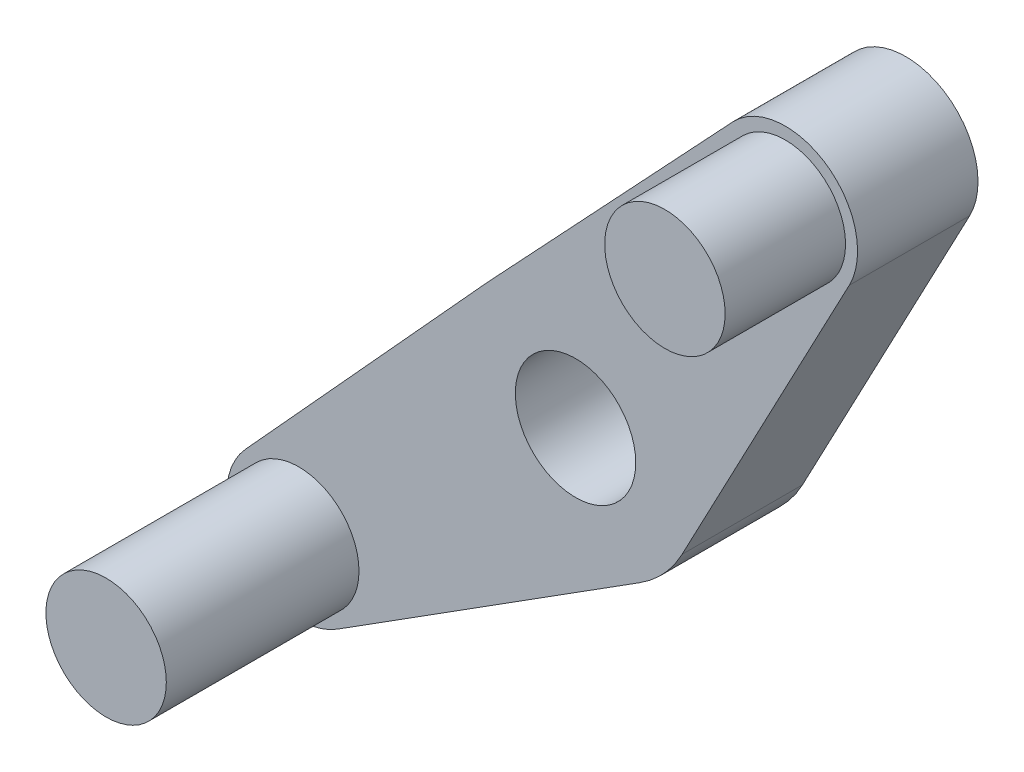
ISO-10303-21;
HEADER;
FILE_DESCRIPTION(('STEP AP214'),'2;1');
FILE_NAME('part.step','',(''),(''),'','','');
FILE_SCHEMA(('AUTOMOTIVE_DESIGN { 1 0 10303 214 1 1 1 1 }'));
ENDSEC;
DATA;
#1=APPLICATION_CONTEXT('core data for automotive mechanical design processes');
#2=APPLICATION_PROTOCOL_DEFINITION('international standard','automotive_design',2000,#1);
#3=PRODUCT_CONTEXT('',#1,'mechanical');
#4=PRODUCT('Part','Part','',(#3));
#5=PRODUCT_RELATED_PRODUCT_CATEGORY('part','',(#4));
#6=PRODUCT_DEFINITION_FORMATION('','',#4);
#7=PRODUCT_DEFINITION_CONTEXT('part definition',#1,'design');
#8=PRODUCT_DEFINITION('design','',#6,#7);
#9=PRODUCT_DEFINITION_SHAPE('','',#8);
#10=(LENGTH_UNIT() NAMED_UNIT(*) SI_UNIT(.MILLI.,.METRE.));
#11=(NAMED_UNIT(*) PLANE_ANGLE_UNIT() SI_UNIT($,.RADIAN.));
#12=(NAMED_UNIT(*) SI_UNIT($,.STERADIAN.) SOLID_ANGLE_UNIT());
#13=UNCERTAINTY_MEASURE_WITH_UNIT(LENGTH_MEASURE(1.E-05),#10,'distance_accuracy_value','');
#14=(GEOMETRIC_REPRESENTATION_CONTEXT(3) GLOBAL_UNCERTAINTY_ASSIGNED_CONTEXT((#13)) GLOBAL_UNIT_ASSIGNED_CONTEXT((#10,
#11,#12)) REPRESENTATION_CONTEXT('',''));
#15=CARTESIAN_POINT('',(0.,0.,0.));
#16=DIRECTION('',(0.,0.,1.));
#17=DIRECTION('',(1.,0.,0.));
#18=AXIS2_PLACEMENT_3D('',#15,#16,#17);
#19=CARTESIAN_POINT('',(0.,0.,-5.));
#20=DIRECTION('',(0.,0.,-1.));
#21=DIRECTION('',(0.,-1.,0.));
#22=AXIS2_PLACEMENT_3D('',#19,#20,#21);
#23=PLANE('',#22);
#24=CARTESIAN_POINT('',(0.,0.,-5.));
#25=DIRECTION('',(0.,0.,1.));
#26=DIRECTION('',(-1.,0.,0.));
#27=AXIS2_PLACEMENT_3D('',#24,#25,#26);
#28=CIRCLE('',#27,2.5);
#29=CARTESIAN_POINT('',(2.5,0.,-5.));
#30=VERTEX_POINT('',#29);
#31=EDGE_CURVE('E27',#30,#30,#28,.T.);
#32=ORIENTED_EDGE('',*,*,#31,.T.);
#33=EDGE_LOOP('',(#32));
#34=FACE_BOUND('',#33,.T.);
#35=CARTESIAN_POINT('',(-11.4906666467847,-9.6418141452981,-5.));
#36=DIRECTION('',(0.,0.,-1.));
#37=DIRECTION('',(1.,0.,0.));
#38=AXIS2_PLACEMENT_3D('',#35,#36,#37);
#39=CIRCLE('',#38,3.);
#40=CARTESIAN_POINT('',(-9.88593946492733,-12.1765430601543,-5.));
#41=VERTEX_POINT('',#40);
#42=CARTESIAN_POINT('',(-13.7082293831372,-7.62131531819111,-5.));
#43=VERTEX_POINT('',#42);
#44=EDGE_CURVE('E118',#41,#43,#39,.T.);
#45=ORIENTED_EDGE('',*,*,#44,.T.);
#46=DIRECTION('',(0.673499609035664,0.739187578784173,0.));
#47=VECTOR('',#46,1.);
#48=CARTESIAN_POINT('',(-13.7082293831372,-7.62131531819111,-5.));
#49=LINE('',#48,#47);
#50=CARTESIAN_POINT('',(-3.69593789392087,3.36749804517832,-5.));
#51=VERTEX_POINT('',#50);
#52=EDGE_CURVE('E121',#43,#51,#49,.T.);
#53=ORIENTED_EDGE('',*,*,#52,.T.);
#54=CARTESIAN_POINT('',(0.,0.,-5.));
#55=DIRECTION('',(0.,0.,-1.));
#56=DIRECTION('',(1.,0.,0.));
#57=AXIS2_PLACEMENT_3D('',#54,#55,#56);
#58=CIRCLE('',#57,5.);
#59=CARTESIAN_POINT('',(-3.647097117574,3.42033369936084,-5.));
#60=VERTEX_POINT('',#59);
#61=EDGE_CURVE('E175',#51,#60,#58,.T.);
#62=ORIENTED_EDGE('',*,*,#61,.T.);
#63=DIRECTION('',(0.684066739872168,0.7294194235148,0.));
#64=VECTOR('',#63,1.);
#65=CARTESIAN_POINT('',(-3.647097117574,3.42033369936084,-5.));
#66=LINE('',#65,#64);
#67=CARTESIAN_POINT('',(6.52228606511969,14.2639329949613,-5.));
#68=VERTEX_POINT('',#67);
#69=EDGE_CURVE('E154',#60,#68,#66,.T.);
#70=ORIENTED_EDGE('',*,*,#69,.T.);
#71=CARTESIAN_POINT('',(8.71054433566409,12.2117327753448,-5.));
#72=DIRECTION('',(0.,0.,-1.));
#73=DIRECTION('',(1.,0.,0.));
#74=AXIS2_PLACEMENT_3D('',#71,#72,#73);
#75=CIRCLE('',#74,3.);
#76=CARTESIAN_POINT('',(11.3633649707772,10.8108249704133,-5.));
#77=VERTEX_POINT('',#76);
#78=EDGE_CURVE('E169',#68,#77,#75,.T.);
#79=ORIENTED_EDGE('',*,*,#78,.T.);
#80=DIRECTION('',(-0.466969268310483,-0.884273545037717,0.));
#81=VECTOR('',#80,1.);
#82=CARTESIAN_POINT('',(11.3633649707772,10.8108249704133,-5.));
#83=LINE('',#82,#81);
#84=CARTESIAN_POINT('',(4.42136772518859,-2.33484634155241,-5.));
#85=VERTEX_POINT('',#84);
#86=EDGE_CURVE('E168',#77,#85,#83,.T.);
#87=ORIENTED_EDGE('',*,*,#86,.T.);
#88=CARTESIAN_POINT('',(0.,0.,-5.));
#89=DIRECTION('',(0.,0.,-1.));
#90=DIRECTION('',(1.,0.,0.));
#91=AXIS2_PLACEMENT_3D('',#88,#89,#90);
#92=CIRCLE('',#91,5.);
#93=CARTESIAN_POINT('',(2.67454530309556,-4.22454819142704,-5.));
#94=VERTEX_POINT('',#93);
#95=EDGE_CURVE('E227',#85,#94,#92,.T.);
#96=ORIENTED_EDGE('',*,*,#95,.T.);
#97=DIRECTION('',(-0.844909638285408,-0.534909060619112,0.));
#98=VECTOR('',#97,1.);
#99=CARTESIAN_POINT('',(2.67454530309556,-4.22454819142704,-5.));
#100=LINE('',#99,#98);
#101=EDGE_CURVE('E124',#94,#41,#100,.T.);
#102=ORIENTED_EDGE('',*,*,#101,.T.);
#103=EDGE_LOOP('',(#45,#53,#62,#70,#79,#87,#96,#102));
#104=FACE_BOUND('',#103,.T.);
#105=ADVANCED_FACE('F16',(#34,#104),#23,.T.);
#106=CARTESIAN_POINT('',(0.,0.,0.));
#107=DIRECTION('',(0.,0.,-1.));
#108=DIRECTION('',(0.,-1.,0.));
#109=AXIS2_PLACEMENT_3D('',#106,#107,#108);
#110=PLANE('',#109);
#111=CARTESIAN_POINT('',(0.,0.,0.));
#112=DIRECTION('',(0.,0.,-1.));
#113=DIRECTION('',(-1.,0.,0.));
#114=AXIS2_PLACEMENT_3D('',#111,#112,#113);
#115=CIRCLE('',#114,2.5);
#116=CARTESIAN_POINT('',(2.5,0.,0.));
#117=VERTEX_POINT('',#116);
#118=EDGE_CURVE('E10',#117,#117,#115,.T.);
#119=ORIENTED_EDGE('',*,*,#118,.T.);
#120=EDGE_LOOP('',(#119));
#121=FACE_BOUND('',#120,.T.);
#122=CARTESIAN_POINT('',(-11.4906666467847,-9.6418141452981,0.));
#123=DIRECTION('',(0.,0.,-1.));
#124=DIRECTION('',(-1.,0.,0.));
#125=AXIS2_PLACEMENT_3D('',#122,#123,#124);
#126=CIRCLE('',#125,2.5);
#127=CARTESIAN_POINT('',(-8.99066664678467,-9.6418141452981,0.));
#128=VERTEX_POINT('',#127);
#129=EDGE_CURVE('E159',#128,#128,#126,.T.);
#130=ORIENTED_EDGE('',*,*,#129,.T.);
#131=EDGE_LOOP('',(#130));
#132=FACE_BOUND('',#131,.T.);
#133=CARTESIAN_POINT('',(8.71054433566409,12.2117327753448,0.));
#134=DIRECTION('',(0.,0.,-1.));
#135=DIRECTION('',(-1.,0.,0.));
#136=AXIS2_PLACEMENT_3D('',#133,#134,#135);
#137=CIRCLE('',#136,2.5);
#138=CARTESIAN_POINT('',(11.2105443356641,12.2117327753448,0.));
#139=VERTEX_POINT('',#138);
#140=EDGE_CURVE('E191',#139,#139,#137,.T.);
#141=ORIENTED_EDGE('',*,*,#140,.T.);
#142=EDGE_LOOP('',(#141));
#143=FACE_BOUND('',#142,.T.);
#144=CARTESIAN_POINT('',(-11.4906666467847,-9.6418141452981,0.));
#145=DIRECTION('',(0.,0.,1.));
#146=DIRECTION('',(1.,0.,0.));
#147=AXIS2_PLACEMENT_3D('',#144,#145,#146);
#148=CIRCLE('',#147,3.);
#149=CARTESIAN_POINT('',(-13.7082293831372,-7.62131531819111,0.));
#150=VERTEX_POINT('',#149);
#151=CARTESIAN_POINT('',(-9.88593946492733,-12.1765430601543,0.));
#152=VERTEX_POINT('',#151);
#153=EDGE_CURVE('E129',#150,#152,#148,.T.);
#154=ORIENTED_EDGE('',*,*,#153,.T.);
#155=DIRECTION('',(0.844909638285408,0.534909060619112,0.));
#156=VECTOR('',#155,1.);
#157=CARTESIAN_POINT('',(-9.88593946492733,-12.1765430601543,0.));
#158=LINE('',#157,#156);
#159=CARTESIAN_POINT('',(2.67454530309556,-4.22454819142704,0.));
#160=VERTEX_POINT('',#159);
#161=EDGE_CURVE('E185',#152,#160,#158,.T.);
#162=ORIENTED_EDGE('',*,*,#161,.T.);
#163=CARTESIAN_POINT('',(0.,0.,0.));
#164=DIRECTION('',(0.,0.,1.));
#165=DIRECTION('',(1.,0.,0.));
#166=AXIS2_PLACEMENT_3D('',#163,#164,#165);
#167=CIRCLE('',#166,5.);
#168=CARTESIAN_POINT('',(4.42136772518859,-2.33484634155241,0.));
#169=VERTEX_POINT('',#168);
#170=EDGE_CURVE('E178',#160,#169,#167,.T.);
#171=ORIENTED_EDGE('',*,*,#170,.T.);
#172=DIRECTION('',(0.466969268310483,0.884273545037717,0.));
#173=VECTOR('',#172,1.);
#174=CARTESIAN_POINT('',(4.42136772518859,-2.33484634155241,0.));
#175=LINE('',#174,#173);
#176=CARTESIAN_POINT('',(11.3633649707772,10.8108249704133,0.));
#177=VERTEX_POINT('',#176);
#178=EDGE_CURVE('E167',#169,#177,#175,.T.);
#179=ORIENTED_EDGE('',*,*,#178,.T.);
#180=CARTESIAN_POINT('',(8.71054433566409,12.2117327753448,0.));
#181=DIRECTION('',(0.,0.,1.));
#182=DIRECTION('',(1.,0.,0.));
#183=AXIS2_PLACEMENT_3D('',#180,#181,#182);
#184=CIRCLE('',#183,3.);
#185=CARTESIAN_POINT('',(6.52228606511969,14.2639329949613,0.));
#186=VERTEX_POINT('',#185);
#187=EDGE_CURVE('E172',#177,#186,#184,.T.);
#188=ORIENTED_EDGE('',*,*,#187,.T.);
#189=DIRECTION('',(-0.684066739872168,-0.7294194235148,0.));
#190=VECTOR('',#189,1.);
#191=CARTESIAN_POINT('',(6.52228606511969,14.2639329949613,0.));
#192=LINE('',#191,#190);
#193=CARTESIAN_POINT('',(-3.647097117574,3.42033369936084,0.));
#194=VERTEX_POINT('',#193);
#195=EDGE_CURVE('E184',#186,#194,#192,.T.);
#196=ORIENTED_EDGE('',*,*,#195,.T.);
#197=CARTESIAN_POINT('',(0.,0.,0.));
#198=DIRECTION('',(0.,0.,1.));
#199=DIRECTION('',(1.,0.,0.));
#200=AXIS2_PLACEMENT_3D('',#197,#198,#199);
#201=CIRCLE('',#200,5.);
#202=CARTESIAN_POINT('',(-3.69593789392087,3.36749804517832,0.));
#203=VERTEX_POINT('',#202);
#204=EDGE_CURVE('E144',#194,#203,#201,.T.);
#205=ORIENTED_EDGE('',*,*,#204,.T.);
#206=DIRECTION('',(-0.673499609035664,-0.739187578784173,0.));
#207=VECTOR('',#206,1.);
#208=CARTESIAN_POINT('',(-3.69593789392087,3.36749804517832,0.));
#209=LINE('',#208,#207);
#210=EDGE_CURVE('E130',#203,#150,#209,.T.);
#211=ORIENTED_EDGE('',*,*,#210,.T.);
#212=EDGE_LOOP('',(#154,#162,#171,#179,#188,#196,#205,#211));
#213=FACE_BOUND('',#212,.T.);
#214=ADVANCED_FACE('F347',(#121,#132,#143,#213),#110,.F.);
#215=CARTESIAN_POINT('',(0.,0.,0.));
#216=DIRECTION('',(0.,0.,-1.));
#217=DIRECTION('',(-1.,0.,0.));
#218=AXIS2_PLACEMENT_3D('',#215,#216,#217);
#219=CYLINDRICAL_SURFACE('',#218,2.5);
#220=ORIENTED_EDGE('',*,*,#118,.F.);
#221=EDGE_LOOP('',(#220));
#222=FACE_BOUND('',#221,.T.);
#223=ORIENTED_EDGE('',*,*,#31,.F.);
#224=EDGE_LOOP('',(#223));
#225=FACE_BOUND('',#224,.T.);
#226=ADVANCED_FACE('F342',(#222,#225),#219,.F.);
#227=CARTESIAN_POINT('',(-11.4906666467847,-9.6418141452981,8.));
#228=DIRECTION('',(0.,0.,-1.));
#229=DIRECTION('',(0.,-1.,0.));
#230=AXIS2_PLACEMENT_3D('',#227,#228,#229);
#231=PLANE('',#230);
#232=CARTESIAN_POINT('',(-11.4906666467847,-9.6418141452981,8.));
#233=DIRECTION('',(0.,0.,-1.));
#234=DIRECTION('',(-1.,0.,0.));
#235=AXIS2_PLACEMENT_3D('',#232,#233,#234);
#236=CIRCLE('',#235,2.5);
#237=CARTESIAN_POINT('',(-8.99066664678467,-9.6418141452981,8.));
#238=VERTEX_POINT('',#237);
#239=EDGE_CURVE('E162',#238,#238,#236,.T.);
#240=ORIENTED_EDGE('',*,*,#239,.F.);
#241=EDGE_LOOP('',(#240));
#242=FACE_BOUND('',#241,.T.);
#243=ADVANCED_FACE('F346',(#242),#231,.F.);
#244=CARTESIAN_POINT('',(-11.4906666467847,-9.6418141452981,0.));
#245=DIRECTION('',(0.,0.,1.));
#246=DIRECTION('',(-1.,0.,0.));
#247=AXIS2_PLACEMENT_3D('',#244,#245,#246);
#248=CYLINDRICAL_SURFACE('',#247,2.5);
#249=ORIENTED_EDGE('',*,*,#129,.F.);
#250=EDGE_LOOP('',(#249));
#251=FACE_BOUND('',#250,.T.);
#252=ORIENTED_EDGE('',*,*,#239,.T.);
#253=EDGE_LOOP('',(#252));
#254=FACE_BOUND('',#253,.T.);
#255=ADVANCED_FACE('F358',(#251,#254),#248,.T.);
#256=CARTESIAN_POINT('',(8.71054433566409,12.2117327753448,5.));
#257=DIRECTION('',(0.,0.,-1.));
#258=DIRECTION('',(0.,-1.,0.));
#259=AXIS2_PLACEMENT_3D('',#256,#257,#258);
#260=PLANE('',#259);
#261=CARTESIAN_POINT('',(8.71054433566409,12.2117327753448,5.));
#262=DIRECTION('',(0.,0.,-1.));
#263=DIRECTION('',(-1.,0.,0.));
#264=AXIS2_PLACEMENT_3D('',#261,#262,#263);
#265=CIRCLE('',#264,2.5);
#266=CARTESIAN_POINT('',(11.2105443356641,12.2117327753448,5.));
#267=VERTEX_POINT('',#266);
#268=EDGE_CURVE('E193',#267,#267,#265,.T.);
#269=ORIENTED_EDGE('',*,*,#268,.F.);
#270=EDGE_LOOP('',(#269));
#271=FACE_BOUND('',#270,.T.);
#272=ADVANCED_FACE('F353',(#271),#260,.F.);
#273=CARTESIAN_POINT('',(8.71054433566409,12.2117327753448,0.));
#274=DIRECTION('',(0.,0.,1.));
#275=DIRECTION('',(-1.,0.,0.));
#276=AXIS2_PLACEMENT_3D('',#273,#274,#275);
#277=CYLINDRICAL_SURFACE('',#276,2.5);
#278=ORIENTED_EDGE('',*,*,#140,.F.);
#279=EDGE_LOOP('',(#278));
#280=FACE_BOUND('',#279,.T.);
#281=ORIENTED_EDGE('',*,*,#268,.T.);
#282=EDGE_LOOP('',(#281));
#283=FACE_BOUND('',#282,.T.);
#284=ADVANCED_FACE('F357',(#280,#283),#277,.T.);
#285=CARTESIAN_POINT('',(8.71054433566409,12.2117327753448,0.));
#286=DIRECTION('',(0.,0.,-1.));
#287=DIRECTION('',(1.,0.,0.));
#288=AXIS2_PLACEMENT_3D('',#285,#286,#287);
#289=CYLINDRICAL_SURFACE('',#288,3.);
#290=ORIENTED_EDGE('',*,*,#78,.F.);
#291=DIRECTION('',(0.,0.,1.));
#292=VECTOR('',#291,1.);
#293=CARTESIAN_POINT('',(6.52228606511969,14.2639329949613,-5.));
#294=LINE('',#293,#292);
#295=EDGE_CURVE('E208',#68,#186,#294,.T.);
#296=ORIENTED_EDGE('',*,*,#295,.T.);
#297=ORIENTED_EDGE('',*,*,#187,.F.);
#298=DIRECTION('',(0.,0.,1.));
#299=VECTOR('',#298,1.);
#300=CARTESIAN_POINT('',(11.3633649707772,10.8108249704133,-5.));
#301=LINE('',#300,#299);
#302=EDGE_CURVE('E163',#77,#177,#301,.T.);
#303=ORIENTED_EDGE('',*,*,#302,.F.);
#304=EDGE_LOOP('',(#290,#296,#297,#303));
#305=FACE_BOUND('',#304,.T.);
#306=ADVANCED_FACE('F327',(#305),#289,.T.);
#307=CARTESIAN_POINT('',(4.42136772518859,-2.33484634155241,0.));
#308=DIRECTION('',(0.884273545037717,-0.466969268310483,0.));
#309=DIRECTION('',(0.,0.,-1.));
#310=AXIS2_PLACEMENT_3D('',#307,#308,#309);
#311=PLANE('',#310);
#312=ORIENTED_EDGE('',*,*,#86,.F.);
#313=ORIENTED_EDGE('',*,*,#302,.T.);
#314=ORIENTED_EDGE('',*,*,#178,.F.);
#315=DIRECTION('',(0.,0.,-1.));
#316=VECTOR('',#315,1.);
#317=CARTESIAN_POINT('',(4.42136772518859,-2.33484634155241,0.));
#318=LINE('',#317,#316);
#319=EDGE_CURVE('E213',#169,#85,#318,.T.);
#320=ORIENTED_EDGE('',*,*,#319,.T.);
#321=EDGE_LOOP('',(#312,#313,#314,#320));
#322=FACE_BOUND('',#321,.T.);
#323=ADVANCED_FACE('F18',(#322),#311,.T.);
#324=CARTESIAN_POINT('',(-11.4906666467847,-9.6418141452981,0.));
#325=DIRECTION('',(0.,0.,-1.));
#326=DIRECTION('',(1.,0.,0.));
#327=AXIS2_PLACEMENT_3D('',#324,#325,#326);
#328=CYLINDRICAL_SURFACE('',#327,3.);
#329=ORIENTED_EDGE('',*,*,#44,.F.);
#330=DIRECTION('',(0.,0.,1.));
#331=VECTOR('',#330,1.);
#332=CARTESIAN_POINT('',(-9.88593946492733,-12.1765430601543,-5.));
#333=LINE('',#332,#331);
#334=EDGE_CURVE('E189',#41,#152,#333,.T.);
#335=ORIENTED_EDGE('',*,*,#334,.T.);
#336=ORIENTED_EDGE('',*,*,#153,.F.);
#337=DIRECTION('',(0.,0.,1.));
#338=VECTOR('',#337,1.);
#339=CARTESIAN_POINT('',(-13.7082293831372,-7.62131531819111,-5.));
#340=LINE('',#339,#338);
#341=EDGE_CURVE('E133',#43,#150,#340,.T.);
#342=ORIENTED_EDGE('',*,*,#341,.F.);
#343=EDGE_LOOP('',(#329,#335,#336,#342));
#344=FACE_BOUND('',#343,.T.);
#345=ADVANCED_FACE('F134',(#344),#328,.T.);
#346=CARTESIAN_POINT('',(-3.69593789392087,3.36749804517832,0.));
#347=DIRECTION('',(-0.739187578784173,0.673499609035664,0.));
#348=DIRECTION('',(0.,0.,1.));
#349=AXIS2_PLACEMENT_3D('',#346,#347,#348);
#350=PLANE('',#349);
#351=ORIENTED_EDGE('',*,*,#52,.F.);
#352=ORIENTED_EDGE('',*,*,#341,.T.);
#353=ORIENTED_EDGE('',*,*,#210,.F.);
#354=DIRECTION('',(0.,0.,-1.));
#355=VECTOR('',#354,1.);
#356=CARTESIAN_POINT('',(-3.69593789392087,3.36749804517832,0.));
#357=LINE('',#356,#355);
#358=EDGE_CURVE('E141',#203,#51,#357,.T.);
#359=ORIENTED_EDGE('',*,*,#358,.T.);
#360=EDGE_LOOP('',(#351,#352,#353,#359));
#361=FACE_BOUND('',#360,.T.);
#362=ADVANCED_FACE('F139',(#361),#350,.T.);
#363=CARTESIAN_POINT('',(0.,0.,0.));
#364=DIRECTION('',(0.,0.,-1.));
#365=DIRECTION('',(1.,0.,0.));
#366=AXIS2_PLACEMENT_3D('',#363,#364,#365);
#367=CYLINDRICAL_SURFACE('',#366,5.);
#368=ORIENTED_EDGE('',*,*,#61,.F.);
#369=ORIENTED_EDGE('',*,*,#358,.F.);
#370=ORIENTED_EDGE('',*,*,#204,.F.);
#371=DIRECTION('',(0.,0.,-1.));
#372=VECTOR('',#371,1.);
#373=CARTESIAN_POINT('',(-3.647097117574,3.42033369936084,0.));
#374=LINE('',#373,#372);
#375=EDGE_CURVE('E158',#194,#60,#374,.T.);
#376=ORIENTED_EDGE('',*,*,#375,.T.);
#377=EDGE_LOOP('',(#368,#369,#370,#376));
#378=FACE_BOUND('',#377,.T.);
#379=ADVANCED_FACE('F421',(#378),#367,.T.);
#380=CARTESIAN_POINT('',(0.,0.,0.));
#381=DIRECTION('',(0.,0.,-1.));
#382=DIRECTION('',(1.,0.,0.));
#383=AXIS2_PLACEMENT_3D('',#380,#381,#382);
#384=CYLINDRICAL_SURFACE('',#383,5.);
#385=ORIENTED_EDGE('',*,*,#95,.F.);
#386=ORIENTED_EDGE('',*,*,#319,.F.);
#387=ORIENTED_EDGE('',*,*,#170,.F.);
#388=DIRECTION('',(0.,0.,-1.));
#389=VECTOR('',#388,1.);
#390=CARTESIAN_POINT('',(2.67454530309556,-4.22454819142704,0.));
#391=LINE('',#390,#389);
#392=EDGE_CURVE('E20',#160,#94,#391,.T.);
#393=ORIENTED_EDGE('',*,*,#392,.T.);
#394=EDGE_LOOP('',(#385,#386,#387,#393));
#395=FACE_BOUND('',#394,.T.);
#396=ADVANCED_FACE('F337',(#395),#384,.T.);
#397=CARTESIAN_POINT('',(-9.88593946492733,-12.1765430601543,0.));
#398=DIRECTION('',(0.534909060619112,-0.844909638285408,0.));
#399=DIRECTION('',(0.,0.,-1.));
#400=AXIS2_PLACEMENT_3D('',#397,#398,#399);
#401=PLANE('',#400);
#402=ORIENTED_EDGE('',*,*,#101,.F.);
#403=ORIENTED_EDGE('',*,*,#392,.F.);
#404=ORIENTED_EDGE('',*,*,#161,.F.);
#405=ORIENTED_EDGE('',*,*,#334,.F.);
#406=EDGE_LOOP('',(#402,#403,#404,#405));
#407=FACE_BOUND('',#406,.T.);
#408=ADVANCED_FACE('F332',(#407),#401,.T.);
#409=CARTESIAN_POINT('',(6.52228606511969,14.2639329949613,0.));
#410=DIRECTION('',(-0.7294194235148,0.684066739872168,0.));
#411=DIRECTION('',(0.,0.,1.));
#412=AXIS2_PLACEMENT_3D('',#409,#410,#411);
#413=PLANE('',#412);
#414=ORIENTED_EDGE('',*,*,#69,.F.);
#415=ORIENTED_EDGE('',*,*,#375,.F.);
#416=ORIENTED_EDGE('',*,*,#195,.F.);
#417=ORIENTED_EDGE('',*,*,#295,.F.);
#418=EDGE_LOOP('',(#414,#415,#416,#417));
#419=FACE_BOUND('',#418,.T.);
#420=ADVANCED_FACE('F336',(#419),#413,.T.);
#421=CLOSED_SHELL('',(#105,#214,#226,#243,#255,#272,#284,#306,#323,#345,#362,#379,#396,#408,#420));
#422=MANIFOLD_SOLID_BREP('B1',#421);
#423=ADVANCED_BREP_SHAPE_REPRESENTATION('',(#18,#422),#14);
#424=SHAPE_DEFINITION_REPRESENTATION(#9,#423);
ENDSEC;
END-ISO-10303-21;
